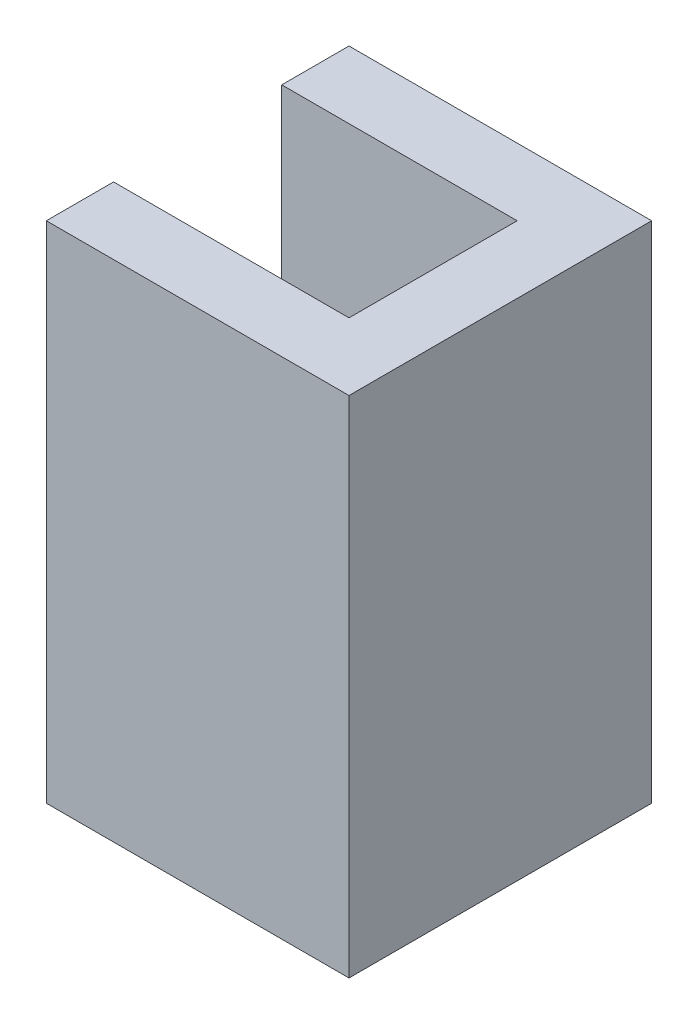
ISO-10303-21;
HEADER;
FILE_DESCRIPTION(('STEP AP214'),'2;1');
FILE_NAME('part.step','',(''),(''),'','','');
FILE_SCHEMA(('AUTOMOTIVE_DESIGN { 1 0 10303 214 1 1 1 1 }'));
ENDSEC;
DATA;
#1=APPLICATION_CONTEXT('core data for automotive mechanical design processes');
#2=APPLICATION_PROTOCOL_DEFINITION('international standard','automotive_design',2000,#1);
#3=PRODUCT_CONTEXT('',#1,'mechanical');
#4=PRODUCT('Part','Part','',(#3));
#5=PRODUCT_RELATED_PRODUCT_CATEGORY('part','',(#4));
#6=PRODUCT_DEFINITION_FORMATION('','',#4);
#7=PRODUCT_DEFINITION_CONTEXT('part definition',#1,'design');
#8=PRODUCT_DEFINITION('design','',#6,#7);
#9=PRODUCT_DEFINITION_SHAPE('','',#8);
#10=(LENGTH_UNIT() NAMED_UNIT(*) SI_UNIT(.MILLI.,.METRE.));
#11=(NAMED_UNIT(*) PLANE_ANGLE_UNIT() SI_UNIT($,.RADIAN.));
#12=(NAMED_UNIT(*) SI_UNIT($,.STERADIAN.) SOLID_ANGLE_UNIT());
#13=UNCERTAINTY_MEASURE_WITH_UNIT(LENGTH_MEASURE(1.E-05),#10,'distance_accuracy_value','');
#14=(GEOMETRIC_REPRESENTATION_CONTEXT(3) GLOBAL_UNCERTAINTY_ASSIGNED_CONTEXT((#13)) GLOBAL_UNIT_ASSIGNED_CONTEXT((#10,
#11,#12)) REPRESENTATION_CONTEXT('',''));
#15=CARTESIAN_POINT('',(0.,0.,0.));
#16=DIRECTION('',(0.,0.,1.));
#17=DIRECTION('',(1.,0.,0.));
#18=AXIS2_PLACEMENT_3D('',#15,#16,#17);
#19=CARTESIAN_POINT('',(-4.5,15.,4.5));
#20=DIRECTION('',(1.,0.,0.));
#21=DIRECTION('',(0.,0.,-1.));
#22=AXIS2_PLACEMENT_3D('',#19,#20,#21);
#23=PLANE('',#22);
#24=DIRECTION('',(0.,0.,1.));
#25=VECTOR('',#24,1.);
#26=CARTESIAN_POINT('',(-4.5,15.,4.5));
#27=LINE('',#26,#25);
#28=CARTESIAN_POINT('',(-4.5,15.,2.5));
#29=VERTEX_POINT('',#28);
#30=CARTESIAN_POINT('',(-4.5,15.,4.5));
#31=VERTEX_POINT('',#30);
#32=EDGE_CURVE('E163',#29,#31,#27,.T.);
#33=ORIENTED_EDGE('',*,*,#32,.F.);
#34=DIRECTION('',(0.,1.,0.));
#35=VECTOR('',#34,1.);
#36=CARTESIAN_POINT('',(-4.5,0.,2.5));
#37=LINE('',#36,#35);
#38=CARTESIAN_POINT('',(-4.5,0.,2.5));
#39=VERTEX_POINT('',#38);
#40=EDGE_CURVE('E132',#39,#29,#37,.T.);
#41=ORIENTED_EDGE('',*,*,#40,.F.);
#42=DIRECTION('',(0.,0.,1.));
#43=VECTOR('',#42,1.);
#44=CARTESIAN_POINT('',(-4.5,0.,4.5));
#45=LINE('',#44,#43);
#46=CARTESIAN_POINT('',(-4.5,0.,4.5));
#47=VERTEX_POINT('',#46);
#48=EDGE_CURVE('E136',#39,#47,#45,.T.);
#49=ORIENTED_EDGE('',*,*,#48,.T.);
#50=DIRECTION('',(0.,-1.,0.));
#51=VECTOR('',#50,1.);
#52=CARTESIAN_POINT('',(-4.5,15.,4.5));
#53=LINE('',#52,#51);
#54=EDGE_CURVE('E146',#31,#47,#53,.T.);
#55=ORIENTED_EDGE('',*,*,#54,.F.);
#56=EDGE_LOOP('',(#33,#41,#49,#55));
#57=FACE_BOUND('',#56,.T.);
#58=ADVANCED_FACE('F38',(#57),#23,.F.);
#59=CARTESIAN_POINT('',(0.,15.,0.));
#60=DIRECTION('',(0.,-1.,0.));
#61=DIRECTION('',(0.,0.,-1.));
#62=AXIS2_PLACEMENT_3D('',#59,#60,#61);
#63=PLANE('',#62);
#64=DIRECTION('',(1.,0.,0.));
#65=VECTOR('',#64,1.);
#66=CARTESIAN_POINT('',(-2.5,15.,2.5));
#67=LINE('',#66,#65);
#68=CARTESIAN_POINT('',(2.5,15.,2.5));
#69=VERTEX_POINT('',#68);
#70=EDGE_CURVE('E167',#29,#69,#67,.T.);
#71=ORIENTED_EDGE('',*,*,#70,.F.);
#72=ORIENTED_EDGE('',*,*,#32,.T.);
#73=DIRECTION('',(1.,0.,0.));
#74=VECTOR('',#73,1.);
#75=CARTESIAN_POINT('',(-4.5,15.,4.5));
#76=LINE('',#75,#74);
#77=CARTESIAN_POINT('',(4.5,15.,4.5));
#78=VERTEX_POINT('',#77);
#79=EDGE_CURVE('E62',#31,#78,#76,.T.);
#80=ORIENTED_EDGE('',*,*,#79,.T.);
#81=DIRECTION('',(0.,0.,-1.));
#82=VECTOR('',#81,1.);
#83=CARTESIAN_POINT('',(4.5,15.,4.5));
#84=LINE('',#83,#82);
#85=CARTESIAN_POINT('',(4.5,15.,-4.5));
#86=VERTEX_POINT('',#85);
#87=EDGE_CURVE('E138',#78,#86,#84,.T.);
#88=ORIENTED_EDGE('',*,*,#87,.T.);
#89=DIRECTION('',(-1.,0.,0.));
#90=VECTOR('',#89,1.);
#91=CARTESIAN_POINT('',(-4.5,15.,-4.5));
#92=LINE('',#91,#90);
#93=CARTESIAN_POINT('',(-4.5,15.,-4.5));
#94=VERTEX_POINT('',#93);
#95=EDGE_CURVE('E90',#86,#94,#92,.T.);
#96=ORIENTED_EDGE('',*,*,#95,.T.);
#97=CARTESIAN_POINT('',(-4.5,15.,-2.5));
#98=VERTEX_POINT('',#97);
#99=EDGE_CURVE('E161',#94,#98,#27,.T.);
#100=ORIENTED_EDGE('',*,*,#99,.T.);
#101=DIRECTION('',(-1.,0.,0.));
#102=VECTOR('',#101,1.);
#103=CARTESIAN_POINT('',(-2.5,15.,-2.5));
#104=LINE('',#103,#102);
#105=CARTESIAN_POINT('',(2.5,15.,-2.5));
#106=VERTEX_POINT('',#105);
#107=EDGE_CURVE('E128',#106,#98,#104,.T.);
#108=ORIENTED_EDGE('',*,*,#107,.F.);
#109=DIRECTION('',(0.,0.,-1.));
#110=VECTOR('',#109,1.);
#111=CARTESIAN_POINT('',(2.5,15.,2.5));
#112=LINE('',#111,#110);
#113=EDGE_CURVE('E168',#69,#106,#112,.T.);
#114=ORIENTED_EDGE('',*,*,#113,.F.);
#115=EDGE_LOOP('',(#71,#72,#80,#88,#96,#100,#108,#114));
#116=FACE_BOUND('',#115,.T.);
#117=ADVANCED_FACE('F178',(#116),#63,.F.);
#118=CARTESIAN_POINT('',(0.,0.,0.));
#119=DIRECTION('',(0.,-1.,0.));
#120=DIRECTION('',(0.,0.,-1.));
#121=AXIS2_PLACEMENT_3D('',#118,#119,#120);
#122=PLANE('',#121);
#123=ORIENTED_EDGE('',*,*,#48,.F.);
#124=DIRECTION('',(1.,0.,0.));
#125=VECTOR('',#124,1.);
#126=CARTESIAN_POINT('',(-2.5,0.,2.5));
#127=LINE('',#126,#125);
#128=CARTESIAN_POINT('',(2.5,0.,2.5));
#129=VERTEX_POINT('',#128);
#130=EDGE_CURVE('E122',#39,#129,#127,.T.);
#131=ORIENTED_EDGE('',*,*,#130,.T.);
#132=DIRECTION('',(0.,0.,-1.));
#133=VECTOR('',#132,1.);
#134=CARTESIAN_POINT('',(2.5,0.,2.5));
#135=LINE('',#134,#133);
#136=CARTESIAN_POINT('',(2.5,0.,-2.5));
#137=VERTEX_POINT('',#136);
#138=EDGE_CURVE('E53',#129,#137,#135,.T.);
#139=ORIENTED_EDGE('',*,*,#138,.T.);
#140=DIRECTION('',(-1.,0.,0.));
#141=VECTOR('',#140,1.);
#142=CARTESIAN_POINT('',(-2.5,0.,-2.5));
#143=LINE('',#142,#141);
#144=CARTESIAN_POINT('',(-4.5,0.,-2.5));
#145=VERTEX_POINT('',#144);
#146=EDGE_CURVE('E113',#137,#145,#143,.T.);
#147=ORIENTED_EDGE('',*,*,#146,.T.);
#148=CARTESIAN_POINT('',(-4.5,0.,-4.5));
#149=VERTEX_POINT('',#148);
#150=EDGE_CURVE('E118',#149,#145,#45,.T.);
#151=ORIENTED_EDGE('',*,*,#150,.F.);
#152=DIRECTION('',(-1.,0.,0.));
#153=VECTOR('',#152,1.);
#154=CARTESIAN_POINT('',(-4.5,0.,-4.5));
#155=LINE('',#154,#153);
#156=CARTESIAN_POINT('',(4.5,0.,-4.5));
#157=VERTEX_POINT('',#156);
#158=EDGE_CURVE('E140',#157,#149,#155,.T.);
#159=ORIENTED_EDGE('',*,*,#158,.F.);
#160=DIRECTION('',(0.,0.,-1.));
#161=VECTOR('',#160,1.);
#162=CARTESIAN_POINT('',(4.5,0.,4.5));
#163=LINE('',#162,#161);
#164=CARTESIAN_POINT('',(4.5,0.,4.5));
#165=VERTEX_POINT('',#164);
#166=EDGE_CURVE('E153',#165,#157,#163,.T.);
#167=ORIENTED_EDGE('',*,*,#166,.F.);
#168=DIRECTION('',(1.,0.,0.));
#169=VECTOR('',#168,1.);
#170=CARTESIAN_POINT('',(-4.5,0.,4.5));
#171=LINE('',#170,#169);
#172=EDGE_CURVE('E83',#47,#165,#171,.T.);
#173=ORIENTED_EDGE('',*,*,#172,.F.);
#174=EDGE_LOOP('',(#123,#131,#139,#147,#151,#159,#167,#173));
#175=FACE_BOUND('',#174,.T.);
#176=ADVANCED_FACE('F116',(#175),#122,.T.);
#177=CARTESIAN_POINT('',(4.5,15.,4.5));
#178=DIRECTION('',(-1.,0.,0.));
#179=DIRECTION('',(0.,0.,1.));
#180=AXIS2_PLACEMENT_3D('',#177,#178,#179);
#181=PLANE('',#180);
#182=ORIENTED_EDGE('',*,*,#166,.T.);
#183=DIRECTION('',(0.,-1.,0.));
#184=VECTOR('',#183,1.);
#185=CARTESIAN_POINT('',(4.5,15.,-4.5));
#186=LINE('',#185,#184);
#187=EDGE_CURVE('E11',#86,#157,#186,.T.);
#188=ORIENTED_EDGE('',*,*,#187,.F.);
#189=ORIENTED_EDGE('',*,*,#87,.F.);
#190=DIRECTION('',(0.,-1.,0.));
#191=VECTOR('',#190,1.);
#192=CARTESIAN_POINT('',(4.5,15.,4.5));
#193=LINE('',#192,#191);
#194=EDGE_CURVE('E144',#78,#165,#193,.T.);
#195=ORIENTED_EDGE('',*,*,#194,.T.);
#196=EDGE_LOOP('',(#182,#188,#189,#195));
#197=FACE_BOUND('',#196,.T.);
#198=ADVANCED_FACE('F40',(#197),#181,.F.);
#199=CARTESIAN_POINT('',(-4.5,15.,-4.5));
#200=DIRECTION('',(0.,0.,1.));
#201=DIRECTION('',(1.,0.,0.));
#202=AXIS2_PLACEMENT_3D('',#199,#200,#201);
#203=PLANE('',#202);
#204=ORIENTED_EDGE('',*,*,#158,.T.);
#205=DIRECTION('',(0.,-1.,0.));
#206=VECTOR('',#205,1.);
#207=CARTESIAN_POINT('',(-4.5,15.,-4.5));
#208=LINE('',#207,#206);
#209=EDGE_CURVE('E46',#94,#149,#208,.T.);
#210=ORIENTED_EDGE('',*,*,#209,.F.);
#211=ORIENTED_EDGE('',*,*,#95,.F.);
#212=ORIENTED_EDGE('',*,*,#187,.T.);
#213=EDGE_LOOP('',(#204,#210,#211,#212));
#214=FACE_BOUND('',#213,.T.);
#215=ADVANCED_FACE('F196',(#214),#203,.F.);
#216=ORIENTED_EDGE('',*,*,#150,.T.);
#217=DIRECTION('',(0.,1.,0.));
#218=VECTOR('',#217,1.);
#219=CARTESIAN_POINT('',(-4.5,0.,-2.5));
#220=LINE('',#219,#218);
#221=EDGE_CURVE('E125',#145,#98,#220,.T.);
#222=ORIENTED_EDGE('',*,*,#221,.T.);
#223=ORIENTED_EDGE('',*,*,#99,.F.);
#224=ORIENTED_EDGE('',*,*,#209,.T.);
#225=EDGE_LOOP('',(#216,#222,#223,#224));
#226=FACE_BOUND('',#225,.T.);
#227=ADVANCED_FACE('F135',(#226),#23,.F.);
#228=CARTESIAN_POINT('',(-4.5,15.,4.5));
#229=DIRECTION('',(0.,0.,-1.));
#230=DIRECTION('',(-1.,0.,0.));
#231=AXIS2_PLACEMENT_3D('',#228,#229,#230);
#232=PLANE('',#231);
#233=ORIENTED_EDGE('',*,*,#172,.T.);
#234=ORIENTED_EDGE('',*,*,#194,.F.);
#235=ORIENTED_EDGE('',*,*,#79,.F.);
#236=ORIENTED_EDGE('',*,*,#54,.T.);
#237=EDGE_LOOP('',(#233,#234,#235,#236));
#238=FACE_BOUND('',#237,.T.);
#239=ADVANCED_FACE('F148',(#238),#232,.F.);
#240=CARTESIAN_POINT('',(2.5,15.,2.5));
#241=DIRECTION('',(-1.,0.,0.));
#242=DIRECTION('',(0.,0.,1.));
#243=AXIS2_PLACEMENT_3D('',#240,#241,#242);
#244=PLANE('',#243);
#245=ORIENTED_EDGE('',*,*,#138,.F.);
#246=DIRECTION('',(0.,-1.,0.));
#247=VECTOR('',#246,1.);
#248=CARTESIAN_POINT('',(2.5,15.,2.5));
#249=LINE('',#248,#247);
#250=EDGE_CURVE('E157',#69,#129,#249,.T.);
#251=ORIENTED_EDGE('',*,*,#250,.F.);
#252=ORIENTED_EDGE('',*,*,#113,.T.);
#253=DIRECTION('',(0.,-1.,0.));
#254=VECTOR('',#253,1.);
#255=CARTESIAN_POINT('',(2.5,15.,-2.5));
#256=LINE('',#255,#254);
#257=EDGE_CURVE('E156',#106,#137,#256,.T.);
#258=ORIENTED_EDGE('',*,*,#257,.T.);
#259=EDGE_LOOP('',(#245,#251,#252,#258));
#260=FACE_BOUND('',#259,.T.);
#261=ADVANCED_FACE('F180',(#260),#244,.T.);
#262=CARTESIAN_POINT('',(-2.5,15.,-2.5));
#263=DIRECTION('',(0.,0.,1.));
#264=DIRECTION('',(1.,0.,0.));
#265=AXIS2_PLACEMENT_3D('',#262,#263,#264);
#266=PLANE('',#265);
#267=ORIENTED_EDGE('',*,*,#146,.F.);
#268=ORIENTED_EDGE('',*,*,#257,.F.);
#269=ORIENTED_EDGE('',*,*,#107,.T.);
#270=ORIENTED_EDGE('',*,*,#221,.F.);
#271=EDGE_LOOP('',(#267,#268,#269,#270));
#272=FACE_BOUND('',#271,.T.);
#273=ADVANCED_FACE('F126',(#272),#266,.T.);
#274=CARTESIAN_POINT('',(-2.5,15.,2.5));
#275=DIRECTION('',(0.,0.,-1.));
#276=DIRECTION('',(-1.,0.,0.));
#277=AXIS2_PLACEMENT_3D('',#274,#275,#276);
#278=PLANE('',#277);
#279=ORIENTED_EDGE('',*,*,#130,.F.);
#280=ORIENTED_EDGE('',*,*,#40,.T.);
#281=ORIENTED_EDGE('',*,*,#70,.T.);
#282=ORIENTED_EDGE('',*,*,#250,.T.);
#283=EDGE_LOOP('',(#279,#280,#281,#282));
#284=FACE_BOUND('',#283,.T.);
#285=ADVANCED_FACE('F177',(#284),#278,.T.);
#286=CLOSED_SHELL('',(#58,#117,#176,#198,#215,#227,#239,#261,#273,#285));
#287=MANIFOLD_SOLID_BREP('B2',#286);
#288=ADVANCED_BREP_SHAPE_REPRESENTATION('',(#18,#287),#14);
#289=SHAPE_DEFINITION_REPRESENTATION(#9,#288);
ENDSEC;
END-ISO-10303-21;
